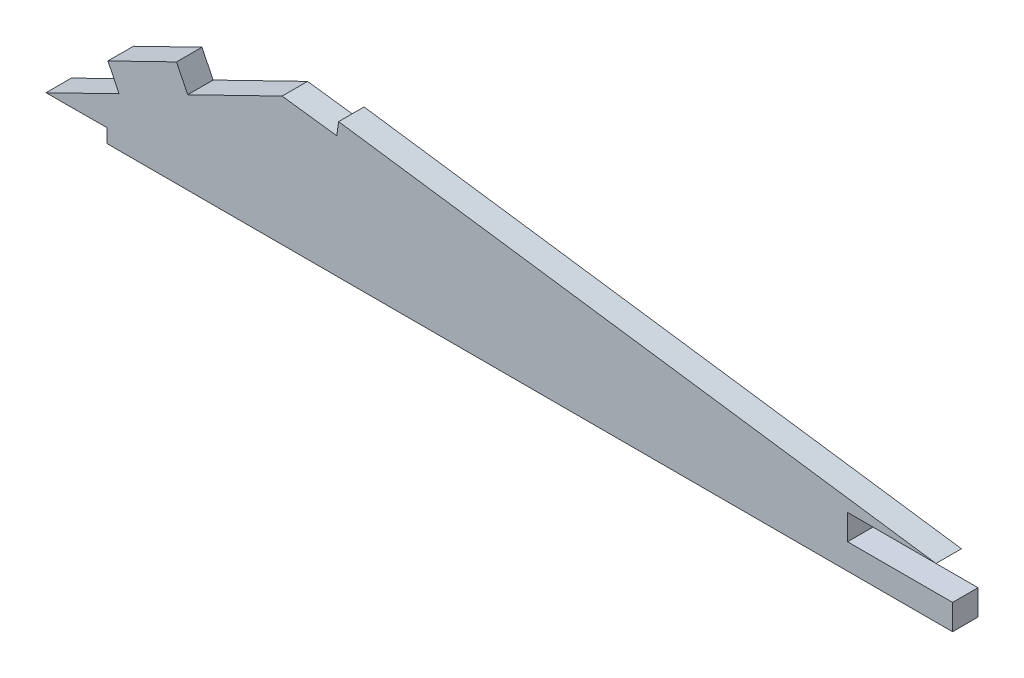
ISO-10303-21;
HEADER;
FILE_DESCRIPTION(('STEP AP214'),'2;1');
FILE_NAME('part.step','',(''),(''),'','','');
FILE_SCHEMA(('AUTOMOTIVE_DESIGN { 1 0 10303 214 1 1 1 1 }'));
ENDSEC;
DATA;
#1=APPLICATION_CONTEXT('core data for automotive mechanical design processes');
#2=APPLICATION_PROTOCOL_DEFINITION('international standard','automotive_design',2000,#1);
#3=PRODUCT_CONTEXT('',#1,'mechanical');
#4=PRODUCT('Part','Part','',(#3));
#5=PRODUCT_RELATED_PRODUCT_CATEGORY('part','',(#4));
#6=PRODUCT_DEFINITION_FORMATION('','',#4);
#7=PRODUCT_DEFINITION_CONTEXT('part definition',#1,'design');
#8=PRODUCT_DEFINITION('design','',#6,#7);
#9=PRODUCT_DEFINITION_SHAPE('','',#8);
#10=(LENGTH_UNIT() NAMED_UNIT(*) SI_UNIT(.MILLI.,.METRE.));
#11=(NAMED_UNIT(*) PLANE_ANGLE_UNIT() SI_UNIT($,.RADIAN.));
#12=(NAMED_UNIT(*) SI_UNIT($,.STERADIAN.) SOLID_ANGLE_UNIT());
#13=UNCERTAINTY_MEASURE_WITH_UNIT(LENGTH_MEASURE(1.E-05),#10,'distance_accuracy_value','');
#14=(GEOMETRIC_REPRESENTATION_CONTEXT(3) GLOBAL_UNCERTAINTY_ASSIGNED_CONTEXT((#13)) GLOBAL_UNIT_ASSIGNED_CONTEXT((#10,
#11,#12)) REPRESENTATION_CONTEXT('',''));
#15=CARTESIAN_POINT('',(0.,0.,0.));
#16=DIRECTION('',(0.,0.,1.));
#17=DIRECTION('',(1.,0.,0.));
#18=AXIS2_PLACEMENT_3D('',#15,#16,#17);
#19=CARTESIAN_POINT('',(7.7559861183291,7.19399602365428,2.));
#20=DIRECTION('',(0.438371146789037,-0.898794046299187,0.));
#21=DIRECTION('',(0.898794046299187,0.438371146789037,0.));
#22=AXIS2_PLACEMENT_3D('',#19,#20,#21);
#23=PLANE('',#22);
#24=DIRECTION('',(-0.898794046299187,-0.438371146789037,0.));
#25=VECTOR('',#24,1.);
#26=CARTESIAN_POINT('',(7.7559861183291,7.19399602365428,0.));
#27=LINE('',#26,#25);
#28=CARTESIAN_POINT('',(7.7559861183291,7.19399602365428,0.));
#29=VERTEX_POINT('',#28);
#30=CARTESIAN_POINT('',(2.0109844537902,4.39197149049386,0.));
#31=VERTEX_POINT('',#30);
#32=EDGE_CURVE('E182',#29,#31,#27,.T.);
#33=ORIENTED_EDGE('',*,*,#32,.T.);
#34=DIRECTION('',(0.,0.,-1.));
#35=VECTOR('',#34,1.);
#36=CARTESIAN_POINT('',(2.0109844537902,4.39197149049386,2.));
#37=LINE('',#36,#35);
#38=CARTESIAN_POINT('',(2.0109844537902,4.39197149049386,2.));
#39=VERTEX_POINT('',#38);
#40=EDGE_CURVE('E11',#39,#31,#37,.T.);
#41=ORIENTED_EDGE('',*,*,#40,.F.);
#42=DIRECTION('',(-0.898794046299187,-0.438371146789037,0.));
#43=VECTOR('',#42,1.);
#44=CARTESIAN_POINT('',(7.7559861183291,7.19399602365428,2.));
#45=LINE('',#44,#43);
#46=CARTESIAN_POINT('',(7.7559861183291,7.19399602365428,2.));
#47=VERTEX_POINT('',#46);
#48=EDGE_CURVE('E225',#47,#39,#45,.T.);
#49=ORIENTED_EDGE('',*,*,#48,.F.);
#50=DIRECTION('',(0.,0.,-1.));
#51=VECTOR('',#50,1.);
#52=CARTESIAN_POINT('',(7.7559861183291,7.19399602365428,2.));
#53=LINE('',#52,#51);
#54=EDGE_CURVE('E178',#47,#29,#53,.T.);
#55=ORIENTED_EDGE('',*,*,#54,.T.);
#56=EDGE_LOOP('',(#33,#41,#49,#55));
#57=FACE_BOUND('',#56,.T.);
#58=ADVANCED_FACE('F39',(#57),#23,.F.);
#59=CARTESIAN_POINT('',(6.79245025203826,4.41052776166242,2.));
#60=DIRECTION('',(-0.00388084579359947,0.999992469489609,0.));
#61=DIRECTION('',(-0.999992469489609,-0.00388084579359947,0.));
#62=AXIS2_PLACEMENT_3D('',#59,#60,#61);
#63=PLANE('',#62);
#64=DIRECTION('',(0.999992469489609,0.00388084579359947,0.));
#65=VECTOR('',#64,1.);
#66=CARTESIAN_POINT('',(6.79245025203826,4.41052776166242,0.));
#67=LINE('',#66,#65);
#68=CARTESIAN_POINT('',(6.79245025203826,4.41052776166242,0.));
#69=VERTEX_POINT('',#68);
#70=EDGE_CURVE('E186',#31,#69,#67,.T.);
#71=ORIENTED_EDGE('',*,*,#70,.T.);
#72=DIRECTION('',(0.,0.,-1.));
#73=VECTOR('',#72,1.);
#74=CARTESIAN_POINT('',(6.79245025203826,4.41052776166242,2.));
#75=LINE('',#74,#73);
#76=CARTESIAN_POINT('',(6.79245025203826,4.41052776166242,2.));
#77=VERTEX_POINT('',#76);
#78=EDGE_CURVE('E48',#77,#69,#75,.T.);
#79=ORIENTED_EDGE('',*,*,#78,.F.);
#80=DIRECTION('',(0.999992469489609,0.00388084579359947,0.));
#81=VECTOR('',#80,1.);
#82=CARTESIAN_POINT('',(6.79245025203826,4.41052776166242,2.));
#83=LINE('',#82,#81);
#84=EDGE_CURVE('E120',#39,#77,#83,.T.);
#85=ORIENTED_EDGE('',*,*,#84,.F.);
#86=ORIENTED_EDGE('',*,*,#40,.T.);
#87=EDGE_LOOP('',(#71,#79,#85,#86));
#88=FACE_BOUND('',#87,.T.);
#89=ADVANCED_FACE('F340',(#88),#63,.F.);
#90=CARTESIAN_POINT('',(6.79665387650502,3.32736366883972,2.));
#91=DIRECTION('',(0.999992469489616,0.00388084579166815,0.));
#92=DIRECTION('',(-0.00388084579166815,0.999992469489616,0.));
#93=AXIS2_PLACEMENT_3D('',#90,#91,#92);
#94=PLANE('',#93);
#95=DIRECTION('',(0.00388084579166815,-0.999992469489616,0.));
#96=VECTOR('',#95,1.);
#97=CARTESIAN_POINT('',(6.79665387650502,3.32736366883972,0.));
#98=LINE('',#97,#96);
#99=CARTESIAN_POINT('',(6.79665387650502,3.32736366883972,0.));
#100=VERTEX_POINT('',#99);
#101=EDGE_CURVE('E189',#69,#100,#98,.T.);
#102=ORIENTED_EDGE('',*,*,#101,.T.);
#103=DIRECTION('',(0.,0.,-1.));
#104=VECTOR('',#103,1.);
#105=CARTESIAN_POINT('',(6.79665387650502,3.32736366883972,2.));
#106=LINE('',#105,#104);
#107=CARTESIAN_POINT('',(6.79665387650502,3.32736366883972,2.));
#108=VERTEX_POINT('',#107);
#109=EDGE_CURVE('E264',#108,#100,#106,.T.);
#110=ORIENTED_EDGE('',*,*,#109,.F.);
#111=DIRECTION('',(0.00388084579166815,-0.999992469489616,0.));
#112=VECTOR('',#111,1.);
#113=CARTESIAN_POINT('',(6.79665387650502,3.32736366883972,2.));
#114=LINE('',#113,#112);
#115=EDGE_CURVE('E274',#77,#108,#114,.T.);
#116=ORIENTED_EDGE('',*,*,#115,.F.);
#117=ORIENTED_EDGE('',*,*,#78,.T.);
#118=EDGE_LOOP('',(#102,#110,#116,#117));
#119=FACE_BOUND('',#118,.T.);
#120=ADVANCED_FACE('F272',(#119),#94,.F.);
#121=CARTESIAN_POINT('',(6.79665387650502,3.32736366883972,2.));
#122=DIRECTION('',(0.,1.,0.));
#123=DIRECTION('',(0.,0.,1.));
#124=AXIS2_PLACEMENT_3D('',#121,#122,#123);
#125=PLANE('',#124);
#126=DIRECTION('',(1.,0.,0.));
#127=VECTOR('',#126,1.);
#128=CARTESIAN_POINT('',(6.79665387650502,3.32736366883972,0.));
#129=LINE('',#128,#127);
#130=CARTESIAN_POINT('',(73.2781243524124,3.32736366883972,0.));
#131=VERTEX_POINT('',#130);
#132=EDGE_CURVE('E192',#100,#131,#129,.T.);
#133=ORIENTED_EDGE('',*,*,#132,.T.);
#134=DIRECTION('',(0.,0.,-1.));
#135=VECTOR('',#134,1.);
#136=CARTESIAN_POINT('',(73.2781243524124,3.32736366883972,2.));
#137=LINE('',#136,#135);
#138=CARTESIAN_POINT('',(73.2781243524124,3.32736366883972,2.));
#139=VERTEX_POINT('',#138);
#140=EDGE_CURVE('E260',#139,#131,#137,.T.);
#141=ORIENTED_EDGE('',*,*,#140,.F.);
#142=DIRECTION('',(1.,0.,0.));
#143=VECTOR('',#142,1.);
#144=CARTESIAN_POINT('',(6.79665387650502,3.32736366883972,2.));
#145=LINE('',#144,#143);
#146=EDGE_CURVE('E293',#108,#139,#145,.T.);
#147=ORIENTED_EDGE('',*,*,#146,.F.);
#148=ORIENTED_EDGE('',*,*,#109,.T.);
#149=EDGE_LOOP('',(#133,#141,#147,#148));
#150=FACE_BOUND('',#149,.T.);
#151=ADVANCED_FACE('F283',(#150),#125,.F.);
#152=CARTESIAN_POINT('',(73.2781243524124,3.32736366883972,2.));
#153=DIRECTION('',(-1.,0.,0.));
#154=DIRECTION('',(0.,0.,1.));
#155=AXIS2_PLACEMENT_3D('',#152,#153,#154);
#156=PLANE('',#155);
#157=DIRECTION('',(0.,1.,0.));
#158=VECTOR('',#157,1.);
#159=CARTESIAN_POINT('',(73.2781243524124,3.32736366883972,0.));
#160=LINE('',#159,#158);
#161=CARTESIAN_POINT('',(73.2781243524124,5.32736366883972,0.));
#162=VERTEX_POINT('',#161);
#163=EDGE_CURVE('E195',#131,#162,#160,.T.);
#164=ORIENTED_EDGE('',*,*,#163,.T.);
#165=DIRECTION('',(0.,0.,-1.));
#166=VECTOR('',#165,1.);
#167=CARTESIAN_POINT('',(73.2781243524124,5.32736366883972,2.));
#168=LINE('',#167,#166);
#169=CARTESIAN_POINT('',(73.2781243524124,5.32736366883972,2.));
#170=VERTEX_POINT('',#169);
#171=EDGE_CURVE('E256',#170,#162,#168,.T.);
#172=ORIENTED_EDGE('',*,*,#171,.F.);
#173=DIRECTION('',(0.,1.,0.));
#174=VECTOR('',#173,1.);
#175=CARTESIAN_POINT('',(73.2781243524124,3.32736366883972,2.));
#176=LINE('',#175,#174);
#177=EDGE_CURVE('E289',#139,#170,#176,.T.);
#178=ORIENTED_EDGE('',*,*,#177,.F.);
#179=ORIENTED_EDGE('',*,*,#140,.T.);
#180=EDGE_LOOP('',(#164,#172,#178,#179));
#181=FACE_BOUND('',#180,.T.);
#182=ADVANCED_FACE('F287',(#181),#156,.F.);
#183=CARTESIAN_POINT('',(65.0219479564304,5.32736366883972,2.));
#184=DIRECTION('',(0.,-1.,0.));
#185=DIRECTION('',(0.,0.,-1.));
#186=AXIS2_PLACEMENT_3D('',#183,#184,#185);
#187=PLANE('',#186);
#188=DIRECTION('',(-1.,0.,0.));
#189=VECTOR('',#188,1.);
#190=CARTESIAN_POINT('',(65.0219479564304,5.32736366883972,0.));
#191=LINE('',#190,#189);
#192=CARTESIAN_POINT('',(65.0219479564304,5.32736366883972,0.));
#193=VERTEX_POINT('',#192);
#194=EDGE_CURVE('E198',#162,#193,#191,.T.);
#195=ORIENTED_EDGE('',*,*,#194,.T.);
#196=DIRECTION('',(0.,0.,-1.));
#197=VECTOR('',#196,1.);
#198=CARTESIAN_POINT('',(65.0219479564304,5.32736366883972,2.));
#199=LINE('',#198,#197);
#200=CARTESIAN_POINT('',(65.0219479564304,5.32736366883972,2.));
#201=VERTEX_POINT('',#200);
#202=EDGE_CURVE('E252',#201,#193,#199,.T.);
#203=ORIENTED_EDGE('',*,*,#202,.F.);
#204=DIRECTION('',(-1.,0.,0.));
#205=VECTOR('',#204,1.);
#206=CARTESIAN_POINT('',(65.0219479564304,5.32736366883972,2.));
#207=LINE('',#206,#205);
#208=EDGE_CURVE('E292',#170,#201,#207,.T.);
#209=ORIENTED_EDGE('',*,*,#208,.F.);
#210=ORIENTED_EDGE('',*,*,#171,.T.);
#211=EDGE_LOOP('',(#195,#203,#209,#210));
#212=FACE_BOUND('',#211,.T.);
#213=ADVANCED_FACE('F353',(#212),#187,.F.);
#214=CARTESIAN_POINT('',(65.0219479564304,5.32736366883972,2.));
#215=DIRECTION('',(-1.,0.,0.));
#216=DIRECTION('',(0.,0.,1.));
#217=AXIS2_PLACEMENT_3D('',#214,#215,#216);
#218=PLANE('',#217);
#219=DIRECTION('',(0.,1.,0.));
#220=VECTOR('',#219,1.);
#221=CARTESIAN_POINT('',(65.0219479564304,5.32736366883972,0.));
#222=LINE('',#221,#220);
#223=CARTESIAN_POINT('',(65.0219479564304,7.32736366884063,0.));
#224=VERTEX_POINT('',#223);
#225=EDGE_CURVE('E201',#193,#224,#222,.T.);
#226=ORIENTED_EDGE('',*,*,#225,.T.);
#227=DIRECTION('',(0.,0.,-1.));
#228=VECTOR('',#227,1.);
#229=CARTESIAN_POINT('',(65.0219479564304,7.32736366884063,2.));
#230=LINE('',#229,#228);
#231=CARTESIAN_POINT('',(65.0219479564304,7.32736366884063,2.));
#232=VERTEX_POINT('',#231);
#233=EDGE_CURVE('E248',#232,#224,#230,.T.);
#234=ORIENTED_EDGE('',*,*,#233,.F.);
#235=DIRECTION('',(0.,1.,0.));
#236=VECTOR('',#235,1.);
#237=CARTESIAN_POINT('',(65.0219479564304,5.32736366883972,2.));
#238=LINE('',#237,#236);
#239=EDGE_CURVE('E297',#201,#232,#238,.T.);
#240=ORIENTED_EDGE('',*,*,#239,.F.);
#241=ORIENTED_EDGE('',*,*,#202,.T.);
#242=EDGE_LOOP('',(#226,#234,#240,#241));
#243=FACE_BOUND('',#242,.T.);
#244=ADVANCED_FACE('F356',(#243),#218,.F.);
#245=CARTESIAN_POINT('',(65.0219479564304,7.32736366884063,2.));
#246=DIRECTION('',(0.,1.,0.));
#247=DIRECTION('',(0.,0.,1.));
#248=AXIS2_PLACEMENT_3D('',#245,#246,#247);
#249=PLANE('',#248);
#250=DIRECTION('',(1.,0.,0.));
#251=VECTOR('',#250,1.);
#252=CARTESIAN_POINT('',(65.0219479564304,7.32736366884063,0.));
#253=LINE('',#252,#251);
#254=CARTESIAN_POINT('',(71.9762860323582,7.32736366884063,0.));
#255=VERTEX_POINT('',#254);
#256=EDGE_CURVE('E204',#224,#255,#253,.T.);
#257=ORIENTED_EDGE('',*,*,#256,.T.);
#258=DIRECTION('',(0.,0.,-1.));
#259=VECTOR('',#258,1.);
#260=CARTESIAN_POINT('',(71.9762860323582,7.32736366884063,2.));
#261=LINE('',#260,#259);
#262=CARTESIAN_POINT('',(71.9762860323582,7.32736366884063,2.));
#263=VERTEX_POINT('',#262);
#264=EDGE_CURVE('E244',#263,#255,#261,.T.);
#265=ORIENTED_EDGE('',*,*,#264,.F.);
#266=DIRECTION('',(1.,0.,0.));
#267=VECTOR('',#266,1.);
#268=CARTESIAN_POINT('',(65.0219479564304,7.32736366884063,2.));
#269=LINE('',#268,#267);
#270=EDGE_CURVE('E304',#232,#263,#269,.T.);
#271=ORIENTED_EDGE('',*,*,#270,.F.);
#272=ORIENTED_EDGE('',*,*,#233,.T.);
#273=EDGE_LOOP('',(#257,#265,#271,#272));
#274=FACE_BOUND('',#273,.T.);
#275=ADVANCED_FACE('F360',(#274),#249,.F.);
#276=CARTESIAN_POINT('',(25.0150673189929,13.9273325454594,2.));
#277=DIRECTION('',(-0.139173100960082,-0.990268068741568,0.));
#278=DIRECTION('',(0.990268068741568,-0.139173100960082,0.));
#279=AXIS2_PLACEMENT_3D('',#276,#277,#278);
#280=PLANE('',#279);
#281=DIRECTION('',(-0.990268068741568,0.139173100960082,0.));
#282=VECTOR('',#281,1.);
#283=CARTESIAN_POINT('',(25.0150673189929,13.9273325454594,0.));
#284=LINE('',#283,#282);
#285=CARTESIAN_POINT('',(25.0150673189929,13.9273325454594,0.));
#286=VERTEX_POINT('',#285);
#287=EDGE_CURVE('E207',#255,#286,#284,.T.);
#288=ORIENTED_EDGE('',*,*,#287,.T.);
#289=DIRECTION('',(0.,0.,-1.));
#290=VECTOR('',#289,1.);
#291=CARTESIAN_POINT('',(25.0150673189929,13.9273325454594,2.));
#292=LINE('',#291,#290);
#293=CARTESIAN_POINT('',(25.0150673189929,13.9273325454594,2.));
#294=VERTEX_POINT('',#293);
#295=EDGE_CURVE('E240',#294,#286,#292,.T.);
#296=ORIENTED_EDGE('',*,*,#295,.F.);
#297=DIRECTION('',(-0.990268068741568,0.139173100960082,0.));
#298=VECTOR('',#297,1.);
#299=CARTESIAN_POINT('',(25.0150673189929,13.9273325454594,2.));
#300=LINE('',#299,#298);
#301=EDGE_CURVE('E307',#263,#294,#300,.T.);
#302=ORIENTED_EDGE('',*,*,#301,.F.);
#303=ORIENTED_EDGE('',*,*,#264,.T.);
#304=EDGE_LOOP('',(#288,#296,#302,#303));
#305=FACE_BOUND('',#304,.T.);
#306=ADVANCED_FACE('F364',(#305),#280,.F.);
#307=CARTESIAN_POINT('',(24.8668572662019,12.8896402880047,2.));
#308=DIRECTION('',(0.98995372681901,-0.141391720963968,0.));
#309=DIRECTION('',(0.141391720963968,0.98995372681901,0.));
#310=AXIS2_PLACEMENT_3D('',#307,#308,#309);
#311=PLANE('',#310);
#312=DIRECTION('',(-0.141391720963968,-0.98995372681901,0.));
#313=VECTOR('',#312,1.);
#314=CARTESIAN_POINT('',(24.8668572662019,12.8896402880047,0.));
#315=LINE('',#314,#313);
#316=CARTESIAN_POINT('',(24.8668572662019,12.8896402880047,0.));
#317=VERTEX_POINT('',#316);
#318=EDGE_CURVE('E210',#286,#317,#315,.T.);
#319=ORIENTED_EDGE('',*,*,#318,.T.);
#320=DIRECTION('',(0.,0.,-1.));
#321=VECTOR('',#320,1.);
#322=CARTESIAN_POINT('',(24.8668572662019,12.8896402880047,2.));
#323=LINE('',#322,#321);
#324=CARTESIAN_POINT('',(24.8668572662019,12.8896402880047,2.));
#325=VERTEX_POINT('',#324);
#326=EDGE_CURVE('E236',#325,#317,#323,.T.);
#327=ORIENTED_EDGE('',*,*,#326,.F.);
#328=DIRECTION('',(-0.141391720963968,-0.98995372681901,0.));
#329=VECTOR('',#328,1.);
#330=CARTESIAN_POINT('',(24.8668572662019,12.8896402880047,2.));
#331=LINE('',#330,#329);
#332=EDGE_CURVE('E310',#294,#325,#331,.T.);
#333=ORIENTED_EDGE('',*,*,#332,.F.);
#334=ORIENTED_EDGE('',*,*,#295,.T.);
#335=EDGE_LOOP('',(#319,#327,#333,#334));
#336=FACE_BOUND('',#335,.T.);
#337=ADVANCED_FACE('F368',(#336),#311,.F.);
#338=CARTESIAN_POINT('',(20.5726316428309,13.4450917220517,2.));
#339=DIRECTION('',(-0.128279776916158,-0.991738019254249,0.));
#340=DIRECTION('',(0.991738019254249,-0.128279776916158,0.));
#341=AXIS2_PLACEMENT_3D('',#338,#339,#340);
#342=PLANE('',#341);
#343=DIRECTION('',(-0.991738019254249,0.128279776916158,0.));
#344=VECTOR('',#343,1.);
#345=CARTESIAN_POINT('',(20.5726316428309,13.4450917220517,0.));
#346=LINE('',#345,#344);
#347=CARTESIAN_POINT('',(20.5726316428309,13.4450917220517,0.));
#348=VERTEX_POINT('',#347);
#349=EDGE_CURVE('E213',#317,#348,#346,.T.);
#350=ORIENTED_EDGE('',*,*,#349,.T.);
#351=DIRECTION('',(0.,0.,-1.));
#352=VECTOR('',#351,1.);
#353=CARTESIAN_POINT('',(20.5726316428309,13.4450917220517,2.));
#354=LINE('',#353,#352);
#355=CARTESIAN_POINT('',(20.5726316428309,13.4450917220517,2.));
#356=VERTEX_POINT('',#355);
#357=EDGE_CURVE('E232',#356,#348,#354,.T.);
#358=ORIENTED_EDGE('',*,*,#357,.F.);
#359=DIRECTION('',(-0.991738019254249,0.128279776916158,0.));
#360=VECTOR('',#359,1.);
#361=CARTESIAN_POINT('',(20.5726316428309,13.4450917220517,2.));
#362=LINE('',#361,#360);
#363=EDGE_CURVE('E313',#325,#356,#362,.T.);
#364=ORIENTED_EDGE('',*,*,#363,.F.);
#365=ORIENTED_EDGE('',*,*,#326,.T.);
#366=EDGE_LOOP('',(#350,#358,#364,#365));
#367=FACE_BOUND('',#366,.T.);
#368=ADVANCED_FACE('F321',(#367),#342,.F.);
#369=CARTESIAN_POINT('',(13.1487503961244,9.82422290438871,2.));
#370=DIRECTION('',(0.438371146789202,-0.898794046299106,0.));
#371=DIRECTION('',(0.898794046299106,0.438371146789202,0.));
#372=AXIS2_PLACEMENT_3D('',#369,#370,#371);
#373=PLANE('',#372);
#374=DIRECTION('',(-0.898794046299106,-0.438371146789202,0.));
#375=VECTOR('',#374,1.);
#376=CARTESIAN_POINT('',(13.1487503961244,9.82422290438871,0.));
#377=LINE('',#376,#375);
#378=CARTESIAN_POINT('',(13.1487503961244,9.82422290438871,0.));
#379=VERTEX_POINT('',#378);
#380=EDGE_CURVE('E216',#348,#379,#377,.T.);
#381=ORIENTED_EDGE('',*,*,#380,.T.);
#382=DIRECTION('',(0.,0.,-1.));
#383=VECTOR('',#382,1.);
#384=CARTESIAN_POINT('',(13.1487503961244,9.82422290438871,2.));
#385=LINE('',#384,#383);
#386=CARTESIAN_POINT('',(13.1487503961244,9.82422290438871,2.));
#387=VERTEX_POINT('',#386);
#388=EDGE_CURVE('E171',#387,#379,#385,.T.);
#389=ORIENTED_EDGE('',*,*,#388,.F.);
#390=DIRECTION('',(-0.898794046299106,-0.438371146789202,0.));
#391=VECTOR('',#390,1.);
#392=CARTESIAN_POINT('',(13.1487503961244,9.82422290438871,2.));
#393=LINE('',#392,#391);
#394=EDGE_CURVE('E160',#356,#387,#393,.T.);
#395=ORIENTED_EDGE('',*,*,#394,.F.);
#396=ORIENTED_EDGE('',*,*,#357,.T.);
#397=EDGE_LOOP('',(#381,#389,#395,#396));
#398=FACE_BOUND('',#397,.T.);
#399=ADVANCED_FACE('F325',(#398),#373,.F.);
#400=CARTESIAN_POINT('',(12.2720081025464,11.6218109969874,2.));
#401=DIRECTION('',(-0.898794046299239,-0.43837114678893,0.));
#402=DIRECTION('',(0.43837114678893,-0.898794046299239,0.));
#403=AXIS2_PLACEMENT_3D('',#400,#401,#402);
#404=PLANE('',#403);
#405=DIRECTION('',(-0.43837114678893,0.898794046299239,0.));
#406=VECTOR('',#405,1.);
#407=CARTESIAN_POINT('',(12.2720081025464,11.6218109969874,0.));
#408=LINE('',#407,#406);
#409=CARTESIAN_POINT('',(12.2720081025464,11.6218109969874,0.));
#410=VERTEX_POINT('',#409);
#411=EDGE_CURVE('E169',#379,#410,#408,.T.);
#412=ORIENTED_EDGE('',*,*,#411,.T.);
#413=DIRECTION('',(0.,0.,-1.));
#414=VECTOR('',#413,1.);
#415=CARTESIAN_POINT('',(12.2720081025464,11.6218109969874,2.));
#416=LINE('',#415,#414);
#417=CARTESIAN_POINT('',(12.2720081025464,11.6218109969874,2.));
#418=VERTEX_POINT('',#417);
#419=EDGE_CURVE('E166',#418,#410,#416,.T.);
#420=ORIENTED_EDGE('',*,*,#419,.F.);
#421=DIRECTION('',(-0.43837114678893,0.898794046299239,0.));
#422=VECTOR('',#421,1.);
#423=CARTESIAN_POINT('',(12.2720081025464,11.6218109969874,2.));
#424=LINE('',#423,#422);
#425=EDGE_CURVE('E154',#387,#418,#424,.T.);
#426=ORIENTED_EDGE('',*,*,#425,.F.);
#427=ORIENTED_EDGE('',*,*,#388,.T.);
#428=EDGE_LOOP('',(#412,#420,#426,#427));
#429=FACE_BOUND('',#428,.T.);
#430=ADVANCED_FACE('F167',(#429),#404,.F.);
#431=CARTESIAN_POINT('',(6.87924382475112,8.99158411625302,2.));
#432=DIRECTION('',(0.438371146789051,-0.89879404629918,0.));
#433=DIRECTION('',(0.89879404629918,0.438371146789051,0.));
#434=AXIS2_PLACEMENT_3D('',#431,#432,#433);
#435=PLANE('',#434);
#436=DIRECTION('',(-0.89879404629918,-0.438371146789051,0.));
#437=VECTOR('',#436,1.);
#438=CARTESIAN_POINT('',(6.87924382475112,8.99158411625302,0.));
#439=LINE('',#438,#437);
#440=CARTESIAN_POINT('',(6.87924382475112,8.99158411625302,0.));
#441=VERTEX_POINT('',#440);
#442=EDGE_CURVE('E106',#410,#441,#439,.T.);
#443=ORIENTED_EDGE('',*,*,#442,.T.);
#444=DIRECTION('',(0.,0.,-1.));
#445=VECTOR('',#444,1.);
#446=CARTESIAN_POINT('',(6.87924382475112,8.99158411625302,2.));
#447=LINE('',#446,#445);
#448=CARTESIAN_POINT('',(6.87924382475112,8.99158411625302,2.));
#449=VERTEX_POINT('',#448);
#450=EDGE_CURVE('E172',#449,#441,#447,.T.);
#451=ORIENTED_EDGE('',*,*,#450,.F.);
#452=DIRECTION('',(-0.89879404629918,-0.438371146789051,0.));
#453=VECTOR('',#452,1.);
#454=CARTESIAN_POINT('',(6.87924382475112,8.99158411625302,2.));
#455=LINE('',#454,#453);
#456=EDGE_CURVE('E158',#418,#449,#455,.T.);
#457=ORIENTED_EDGE('',*,*,#456,.F.);
#458=ORIENTED_EDGE('',*,*,#419,.T.);
#459=EDGE_LOOP('',(#443,#451,#457,#458));
#460=FACE_BOUND('',#459,.T.);
#461=ADVANCED_FACE('F174',(#460),#435,.F.);
#462=CARTESIAN_POINT('',(7.7559861183291,7.19399602365428,2.));
#463=DIRECTION('',(0.898794046299239,0.43837114678893,0.));
#464=DIRECTION('',(-0.43837114678893,0.898794046299239,0.));
#465=AXIS2_PLACEMENT_3D('',#462,#463,#464);
#466=PLANE('',#465);
#467=DIRECTION('',(0.43837114678893,-0.898794046299239,0.));
#468=VECTOR('',#467,1.);
#469=CARTESIAN_POINT('',(7.7559861183291,7.19399602365428,0.));
#470=LINE('',#469,#468);
#471=EDGE_CURVE('E112',#441,#29,#470,.T.);
#472=ORIENTED_EDGE('',*,*,#471,.T.);
#473=ORIENTED_EDGE('',*,*,#54,.F.);
#474=DIRECTION('',(0.43837114678893,-0.898794046299239,0.));
#475=VECTOR('',#474,1.);
#476=CARTESIAN_POINT('',(7.7559861183291,7.19399602365428,2.));
#477=LINE('',#476,#475);
#478=EDGE_CURVE('E56',#449,#47,#477,.T.);
#479=ORIENTED_EDGE('',*,*,#478,.F.);
#480=ORIENTED_EDGE('',*,*,#450,.T.);
#481=EDGE_LOOP('',(#472,#473,#479,#480));
#482=FACE_BOUND('',#481,.T.);
#483=ADVANCED_FACE('F329',(#482),#466,.F.);
#484=CARTESIAN_POINT('',(0.,0.,2.));
#485=DIRECTION('',(0.,0.,1.));
#486=DIRECTION('',(1.,0.,0.));
#487=AXIS2_PLACEMENT_3D('',#484,#485,#486);
#488=PLANE('',#487);
#489=ORIENTED_EDGE('',*,*,#48,.T.);
#490=ORIENTED_EDGE('',*,*,#84,.T.);
#491=ORIENTED_EDGE('',*,*,#115,.T.);
#492=ORIENTED_EDGE('',*,*,#146,.T.);
#493=ORIENTED_EDGE('',*,*,#177,.T.);
#494=ORIENTED_EDGE('',*,*,#208,.T.);
#495=ORIENTED_EDGE('',*,*,#239,.T.);
#496=ORIENTED_EDGE('',*,*,#270,.T.);
#497=ORIENTED_EDGE('',*,*,#301,.T.);
#498=ORIENTED_EDGE('',*,*,#332,.T.);
#499=ORIENTED_EDGE('',*,*,#363,.T.);
#500=ORIENTED_EDGE('',*,*,#394,.T.);
#501=ORIENTED_EDGE('',*,*,#425,.T.);
#502=ORIENTED_EDGE('',*,*,#456,.T.);
#503=ORIENTED_EDGE('',*,*,#478,.T.);
#504=EDGE_LOOP('',(#489,#490,#491,#492,#493,#494,#495,#496,#497,#498,#499,#500,#501,#502,#503));
#505=FACE_BOUND('',#504,.T.);
#506=ADVANCED_FACE('F156',(#505),#488,.T.);
#507=CARTESIAN_POINT('',(0.,0.,0.));
#508=DIRECTION('',(0.,0.,1.));
#509=DIRECTION('',(1.,0.,0.));
#510=AXIS2_PLACEMENT_3D('',#507,#508,#509);
#511=PLANE('',#510);
#512=ORIENTED_EDGE('',*,*,#32,.F.);
#513=ORIENTED_EDGE('',*,*,#471,.F.);
#514=ORIENTED_EDGE('',*,*,#442,.F.);
#515=ORIENTED_EDGE('',*,*,#411,.F.);
#516=ORIENTED_EDGE('',*,*,#380,.F.);
#517=ORIENTED_EDGE('',*,*,#349,.F.);
#518=ORIENTED_EDGE('',*,*,#318,.F.);
#519=ORIENTED_EDGE('',*,*,#287,.F.);
#520=ORIENTED_EDGE('',*,*,#256,.F.);
#521=ORIENTED_EDGE('',*,*,#225,.F.);
#522=ORIENTED_EDGE('',*,*,#194,.F.);
#523=ORIENTED_EDGE('',*,*,#163,.F.);
#524=ORIENTED_EDGE('',*,*,#132,.F.);
#525=ORIENTED_EDGE('',*,*,#101,.F.);
#526=ORIENTED_EDGE('',*,*,#70,.F.);
#527=EDGE_LOOP('',(#512,#513,#514,#515,#516,#517,#518,#519,#520,#521,#522,#523,#524,#525,#526));
#528=FACE_BOUND('',#527,.T.);
#529=ADVANCED_FACE('F278',(#528),#511,.F.);
#530=CLOSED_SHELL('',(#58,#89,#120,#151,#182,#213,#244,#275,#306,#337,#368,#399,#430,#461,#483,
#506,#529));
#531=MANIFOLD_SOLID_BREP('B2',#530);
#532=ADVANCED_BREP_SHAPE_REPRESENTATION('',(#18,#531),#14);
#533=SHAPE_DEFINITION_REPRESENTATION(#9,#532);
ENDSEC;
END-ISO-10303-21;
